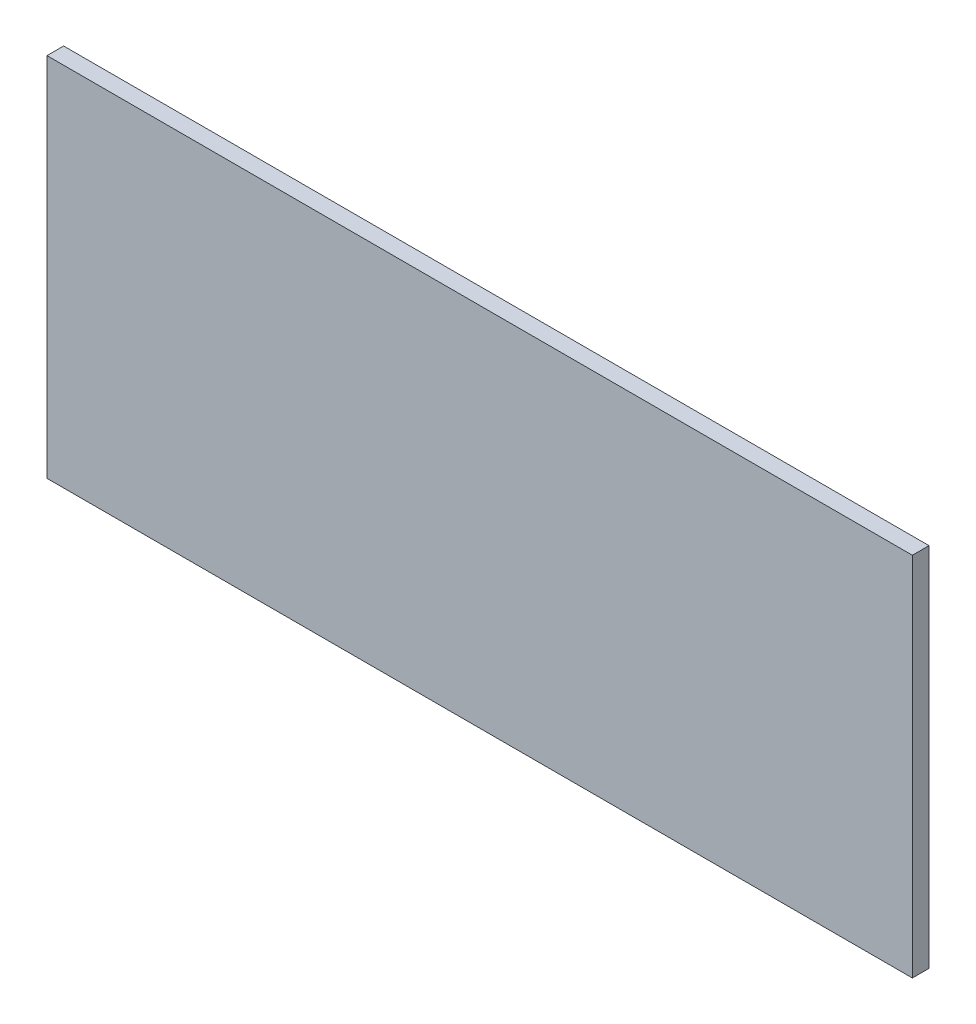
ISO-10303-21;
HEADER;
FILE_DESCRIPTION(('STEP AP214'),'2;1');
FILE_NAME('part.step','',(''),(''),'','','');
FILE_SCHEMA(('AUTOMOTIVE_DESIGN { 1 0 10303 214 1 1 1 1 }'));
ENDSEC;
DATA;
#1=APPLICATION_CONTEXT('core data for automotive mechanical design processes');
#2=APPLICATION_PROTOCOL_DEFINITION('international standard','automotive_design',2000,#1);
#3=PRODUCT_CONTEXT('',#1,'mechanical');
#4=PRODUCT('Part','Part','',(#3));
#5=PRODUCT_RELATED_PRODUCT_CATEGORY('part','',(#4));
#6=PRODUCT_DEFINITION_FORMATION('','',#4);
#7=PRODUCT_DEFINITION_CONTEXT('part definition',#1,'design');
#8=PRODUCT_DEFINITION('design','',#6,#7);
#9=PRODUCT_DEFINITION_SHAPE('','',#8);
#10=(LENGTH_UNIT() NAMED_UNIT(*) SI_UNIT(.MILLI.,.METRE.));
#11=(NAMED_UNIT(*) PLANE_ANGLE_UNIT() SI_UNIT($,.RADIAN.));
#12=(NAMED_UNIT(*) SI_UNIT($,.STERADIAN.) SOLID_ANGLE_UNIT());
#13=UNCERTAINTY_MEASURE_WITH_UNIT(LENGTH_MEASURE(1.E-05),#10,'distance_accuracy_value','');
#14=(GEOMETRIC_REPRESENTATION_CONTEXT(3) GLOBAL_UNCERTAINTY_ASSIGNED_CONTEXT((#13)) GLOBAL_UNIT_ASSIGNED_CONTEXT((#10,
#11,#12)) REPRESENTATION_CONTEXT('',''));
#15=CARTESIAN_POINT('',(0.,0.,0.));
#16=DIRECTION('',(0.,0.,1.));
#17=DIRECTION('',(1.,0.,0.));
#18=AXIS2_PLACEMENT_3D('',#15,#16,#17);
#19=CARTESIAN_POINT('',(78.,-33.,3.));
#20=DIRECTION('',(-1.,0.,0.));
#21=DIRECTION('',(0.,0.,1.));
#22=AXIS2_PLACEMENT_3D('',#19,#20,#21);
#23=PLANE('',#22);
#24=DIRECTION('',(0.,1.,0.));
#25=VECTOR('',#24,1.);
#26=CARTESIAN_POINT('',(78.,-33.,0.));
#27=LINE('',#26,#25);
#28=CARTESIAN_POINT('',(78.,-33.,0.));
#29=VERTEX_POINT('',#28);
#30=CARTESIAN_POINT('',(78.,33.,0.));
#31=VERTEX_POINT('',#30);
#32=EDGE_CURVE('E96',#29,#31,#27,.T.);
#33=ORIENTED_EDGE('',*,*,#32,.T.);
#34=DIRECTION('',(0.,0.,-1.));
#35=VECTOR('',#34,1.);
#36=CARTESIAN_POINT('',(78.,33.,3.));
#37=LINE('',#36,#35);
#38=CARTESIAN_POINT('',(78.,33.,3.));
#39=VERTEX_POINT('',#38);
#40=EDGE_CURVE('E11',#39,#31,#37,.T.);
#41=ORIENTED_EDGE('',*,*,#40,.F.);
#42=DIRECTION('',(0.,1.,0.));
#43=VECTOR('',#42,1.);
#44=CARTESIAN_POINT('',(78.,-33.,3.));
#45=LINE('',#44,#43);
#46=CARTESIAN_POINT('',(78.,-33.,3.));
#47=VERTEX_POINT('',#46);
#48=EDGE_CURVE('E84',#47,#39,#45,.T.);
#49=ORIENTED_EDGE('',*,*,#48,.F.);
#50=DIRECTION('',(0.,0.,-1.));
#51=VECTOR('',#50,1.);
#52=CARTESIAN_POINT('',(78.,-33.,3.));
#53=LINE('',#52,#51);
#54=EDGE_CURVE('E92',#47,#29,#53,.T.);
#55=ORIENTED_EDGE('',*,*,#54,.T.);
#56=EDGE_LOOP('',(#33,#41,#49,#55));
#57=FACE_BOUND('',#56,.T.);
#58=ADVANCED_FACE('F33',(#57),#23,.F.);
#59=CARTESIAN_POINT('',(-78.,33.,3.));
#60=DIRECTION('',(0.,-1.,0.));
#61=DIRECTION('',(0.,0.,-1.));
#62=AXIS2_PLACEMENT_3D('',#59,#60,#61);
#63=PLANE('',#62);
#64=DIRECTION('',(-1.,0.,0.));
#65=VECTOR('',#64,1.);
#66=CARTESIAN_POINT('',(-78.,33.,0.));
#67=LINE('',#66,#65);
#68=CARTESIAN_POINT('',(-78.,33.,0.));
#69=VERTEX_POINT('',#68);
#70=EDGE_CURVE('E88',#31,#69,#67,.T.);
#71=ORIENTED_EDGE('',*,*,#70,.T.);
#72=DIRECTION('',(0.,0.,-1.));
#73=VECTOR('',#72,1.);
#74=CARTESIAN_POINT('',(-78.,33.,3.));
#75=LINE('',#74,#73);
#76=CARTESIAN_POINT('',(-78.,33.,3.));
#77=VERTEX_POINT('',#76);
#78=EDGE_CURVE('E41',#77,#69,#75,.T.);
#79=ORIENTED_EDGE('',*,*,#78,.F.);
#80=DIRECTION('',(-1.,0.,0.));
#81=VECTOR('',#80,1.);
#82=CARTESIAN_POINT('',(-78.,33.,3.));
#83=LINE('',#82,#81);
#84=EDGE_CURVE('E79',#39,#77,#83,.T.);
#85=ORIENTED_EDGE('',*,*,#84,.F.);
#86=ORIENTED_EDGE('',*,*,#40,.T.);
#87=EDGE_LOOP('',(#71,#79,#85,#86));
#88=FACE_BOUND('',#87,.T.);
#89=ADVANCED_FACE('F87',(#88),#63,.F.);
#90=CARTESIAN_POINT('',(-78.,-33.,3.));
#91=DIRECTION('',(1.,0.,0.));
#92=DIRECTION('',(0.,0.,-1.));
#93=AXIS2_PLACEMENT_3D('',#90,#91,#92);
#94=PLANE('',#93);
#95=DIRECTION('',(0.,-1.,0.));
#96=VECTOR('',#95,1.);
#97=CARTESIAN_POINT('',(-78.,-33.,0.));
#98=LINE('',#97,#96);
#99=CARTESIAN_POINT('',(-78.,-33.,0.));
#100=VERTEX_POINT('',#99);
#101=EDGE_CURVE('E66',#69,#100,#98,.T.);
#102=ORIENTED_EDGE('',*,*,#101,.T.);
#103=DIRECTION('',(0.,0.,-1.));
#104=VECTOR('',#103,1.);
#105=CARTESIAN_POINT('',(-78.,-33.,3.));
#106=LINE('',#105,#104);
#107=CARTESIAN_POINT('',(-78.,-33.,3.));
#108=VERTEX_POINT('',#107);
#109=EDGE_CURVE('E89',#108,#100,#106,.T.);
#110=ORIENTED_EDGE('',*,*,#109,.F.);
#111=DIRECTION('',(0.,-1.,0.));
#112=VECTOR('',#111,1.);
#113=CARTESIAN_POINT('',(-78.,-33.,3.));
#114=LINE('',#113,#112);
#115=EDGE_CURVE('E82',#77,#108,#114,.T.);
#116=ORIENTED_EDGE('',*,*,#115,.F.);
#117=ORIENTED_EDGE('',*,*,#78,.T.);
#118=EDGE_LOOP('',(#102,#110,#116,#117));
#119=FACE_BOUND('',#118,.T.);
#120=ADVANCED_FACE('F90',(#119),#94,.F.);
#121=CARTESIAN_POINT('',(-78.,-33.,3.));
#122=DIRECTION('',(0.,1.,0.));
#123=DIRECTION('',(0.,0.,1.));
#124=AXIS2_PLACEMENT_3D('',#121,#122,#123);
#125=PLANE('',#124);
#126=DIRECTION('',(1.,0.,0.));
#127=VECTOR('',#126,1.);
#128=CARTESIAN_POINT('',(-78.,-33.,0.));
#129=LINE('',#128,#127);
#130=EDGE_CURVE('E72',#100,#29,#129,.T.);
#131=ORIENTED_EDGE('',*,*,#130,.T.);
#132=ORIENTED_EDGE('',*,*,#54,.F.);
#133=DIRECTION('',(1.,0.,0.));
#134=VECTOR('',#133,1.);
#135=CARTESIAN_POINT('',(-78.,-33.,3.));
#136=LINE('',#135,#134);
#137=EDGE_CURVE('E49',#108,#47,#136,.T.);
#138=ORIENTED_EDGE('',*,*,#137,.F.);
#139=ORIENTED_EDGE('',*,*,#109,.T.);
#140=EDGE_LOOP('',(#131,#132,#138,#139));
#141=FACE_BOUND('',#140,.T.);
#142=ADVANCED_FACE('F103',(#141),#125,.F.);
#143=CARTESIAN_POINT('',(0.,0.,3.));
#144=DIRECTION('',(0.,0.,-1.));
#145=DIRECTION('',(-1.,0.,0.));
#146=AXIS2_PLACEMENT_3D('',#143,#144,#145);
#147=PLANE('',#146);
#148=ORIENTED_EDGE('',*,*,#48,.T.);
#149=ORIENTED_EDGE('',*,*,#84,.T.);
#150=ORIENTED_EDGE('',*,*,#115,.T.);
#151=ORIENTED_EDGE('',*,*,#137,.T.);
#152=EDGE_LOOP('',(#148,#149,#150,#151));
#153=FACE_BOUND('',#152,.T.);
#154=ADVANCED_FACE('F80',(#153),#147,.F.);
#155=CARTESIAN_POINT('',(0.,0.,0.));
#156=DIRECTION('',(0.,0.,-1.));
#157=DIRECTION('',(-1.,0.,0.));
#158=AXIS2_PLACEMENT_3D('',#155,#156,#157);
#159=PLANE('',#158);
#160=ORIENTED_EDGE('',*,*,#32,.F.);
#161=ORIENTED_EDGE('',*,*,#130,.F.);
#162=ORIENTED_EDGE('',*,*,#101,.F.);
#163=ORIENTED_EDGE('',*,*,#70,.F.);
#164=EDGE_LOOP('',(#160,#161,#162,#163));
#165=FACE_BOUND('',#164,.T.);
#166=ADVANCED_FACE('F106',(#165),#159,.T.);
#167=CLOSED_SHELL('',(#58,#89,#120,#142,#154,#166));
#168=MANIFOLD_SOLID_BREP('B2',#167);
#169=ADVANCED_BREP_SHAPE_REPRESENTATION('',(#18,#168),#14);
#170=SHAPE_DEFINITION_REPRESENTATION(#9,#169);
ENDSEC;
END-ISO-10303-21;
